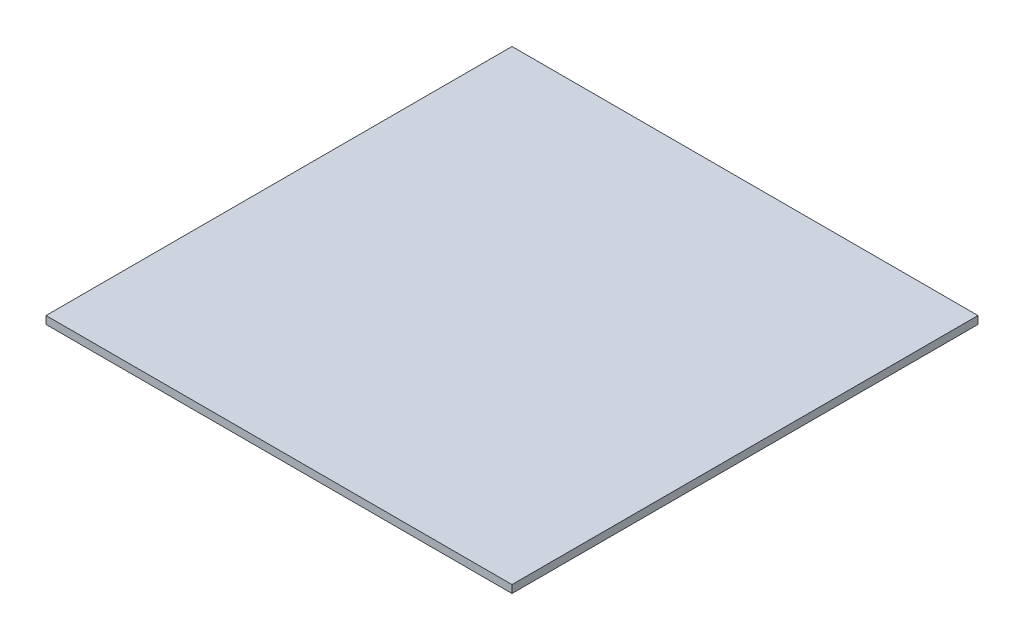
ISO-10303-21;
HEADER;
FILE_DESCRIPTION(('STEP AP214'),'2;1');
FILE_NAME('part.step','',(''),(''),'','','');
FILE_SCHEMA(('AUTOMOTIVE_DESIGN { 1 0 10303 214 1 1 1 1 }'));
ENDSEC;
DATA;
#1=APPLICATION_CONTEXT('core data for automotive mechanical design processes');
#2=APPLICATION_PROTOCOL_DEFINITION('international standard','automotive_design',2000,#1);
#3=PRODUCT_CONTEXT('',#1,'mechanical');
#4=PRODUCT('Part','Part','',(#3));
#5=PRODUCT_RELATED_PRODUCT_CATEGORY('part','',(#4));
#6=PRODUCT_DEFINITION_FORMATION('','',#4);
#7=PRODUCT_DEFINITION_CONTEXT('part definition',#1,'design');
#8=PRODUCT_DEFINITION('design','',#6,#7);
#9=PRODUCT_DEFINITION_SHAPE('','',#8);
#10=(LENGTH_UNIT() NAMED_UNIT(*) SI_UNIT(.MILLI.,.METRE.));
#11=(NAMED_UNIT(*) PLANE_ANGLE_UNIT() SI_UNIT($,.RADIAN.));
#12=(NAMED_UNIT(*) SI_UNIT($,.STERADIAN.) SOLID_ANGLE_UNIT());
#13=UNCERTAINTY_MEASURE_WITH_UNIT(LENGTH_MEASURE(1.E-05),#10,'distance_accuracy_value','');
#14=(GEOMETRIC_REPRESENTATION_CONTEXT(3) GLOBAL_UNCERTAINTY_ASSIGNED_CONTEXT((#13)) GLOBAL_UNIT_ASSIGNED_CONTEXT((#10,
#11,#12)) REPRESENTATION_CONTEXT('',''));
#15=CARTESIAN_POINT('',(0.,0.,0.));
#16=DIRECTION('',(0.,0.,1.));
#17=DIRECTION('',(1.,0.,0.));
#18=AXIS2_PLACEMENT_3D('',#15,#16,#17);
#19=CARTESIAN_POINT('',(150.,5.,-150.));
#20=DIRECTION('',(-1.,0.,0.));
#21=DIRECTION('',(0.,0.,1.));
#22=AXIS2_PLACEMENT_3D('',#19,#20,#21);
#23=PLANE('',#22);
#24=DIRECTION('',(0.,0.,-1.));
#25=VECTOR('',#24,1.);
#26=CARTESIAN_POINT('',(150.,0.,-150.));
#27=LINE('',#26,#25);
#28=CARTESIAN_POINT('',(150.,0.,150.));
#29=VERTEX_POINT('',#28);
#30=CARTESIAN_POINT('',(150.,0.,-150.));
#31=VERTEX_POINT('',#30);
#32=EDGE_CURVE('E99',#29,#31,#27,.T.);
#33=ORIENTED_EDGE('',*,*,#32,.T.);
#34=DIRECTION('',(0.,-1.,0.));
#35=VECTOR('',#34,1.);
#36=CARTESIAN_POINT('',(150.,5.,-150.));
#37=LINE('',#36,#35);
#38=CARTESIAN_POINT('',(150.,5.,-150.));
#39=VERTEX_POINT('',#38);
#40=EDGE_CURVE('E11',#39,#31,#37,.T.);
#41=ORIENTED_EDGE('',*,*,#40,.F.);
#42=DIRECTION('',(0.,0.,-1.));
#43=VECTOR('',#42,1.);
#44=CARTESIAN_POINT('',(150.,5.,-150.));
#45=LINE('',#44,#43);
#46=CARTESIAN_POINT('',(150.,5.,150.));
#47=VERTEX_POINT('',#46);
#48=EDGE_CURVE('E87',#47,#39,#45,.T.);
#49=ORIENTED_EDGE('',*,*,#48,.F.);
#50=DIRECTION('',(0.,-1.,0.));
#51=VECTOR('',#50,1.);
#52=CARTESIAN_POINT('',(150.,5.,150.));
#53=LINE('',#52,#51);
#54=EDGE_CURVE('E95',#47,#29,#53,.T.);
#55=ORIENTED_EDGE('',*,*,#54,.T.);
#56=EDGE_LOOP('',(#33,#41,#49,#55));
#57=FACE_BOUND('',#56,.T.);
#58=ADVANCED_FACE('F36',(#57),#23,.F.);
#59=CARTESIAN_POINT('',(-150.,5.,-150.));
#60=DIRECTION('',(0.,0.,1.));
#61=DIRECTION('',(1.,0.,0.));
#62=AXIS2_PLACEMENT_3D('',#59,#60,#61);
#63=PLANE('',#62);
#64=DIRECTION('',(-1.,0.,0.));
#65=VECTOR('',#64,1.);
#66=CARTESIAN_POINT('',(-150.,0.,-150.));
#67=LINE('',#66,#65);
#68=CARTESIAN_POINT('',(-150.,0.,-150.));
#69=VERTEX_POINT('',#68);
#70=EDGE_CURVE('E91',#31,#69,#67,.T.);
#71=ORIENTED_EDGE('',*,*,#70,.T.);
#72=DIRECTION('',(0.,-1.,0.));
#73=VECTOR('',#72,1.);
#74=CARTESIAN_POINT('',(-150.,5.,-150.));
#75=LINE('',#74,#73);
#76=CARTESIAN_POINT('',(-150.,5.,-150.));
#77=VERTEX_POINT('',#76);
#78=EDGE_CURVE('E44',#77,#69,#75,.T.);
#79=ORIENTED_EDGE('',*,*,#78,.F.);
#80=DIRECTION('',(-1.,0.,0.));
#81=VECTOR('',#80,1.);
#82=CARTESIAN_POINT('',(-150.,5.,-150.));
#83=LINE('',#82,#81);
#84=EDGE_CURVE('E82',#39,#77,#83,.T.);
#85=ORIENTED_EDGE('',*,*,#84,.F.);
#86=ORIENTED_EDGE('',*,*,#40,.T.);
#87=EDGE_LOOP('',(#71,#79,#85,#86));
#88=FACE_BOUND('',#87,.T.);
#89=ADVANCED_FACE('F90',(#88),#63,.F.);
#90=CARTESIAN_POINT('',(-150.,5.,-150.));
#91=DIRECTION('',(1.,0.,0.));
#92=DIRECTION('',(0.,0.,-1.));
#93=AXIS2_PLACEMENT_3D('',#90,#91,#92);
#94=PLANE('',#93);
#95=DIRECTION('',(0.,0.,1.));
#96=VECTOR('',#95,1.);
#97=CARTESIAN_POINT('',(-150.,0.,-150.));
#98=LINE('',#97,#96);
#99=CARTESIAN_POINT('',(-150.,0.,150.));
#100=VERTEX_POINT('',#99);
#101=EDGE_CURVE('E69',#69,#100,#98,.T.);
#102=ORIENTED_EDGE('',*,*,#101,.T.);
#103=DIRECTION('',(0.,-1.,0.));
#104=VECTOR('',#103,1.);
#105=CARTESIAN_POINT('',(-150.,5.,150.));
#106=LINE('',#105,#104);
#107=CARTESIAN_POINT('',(-150.,5.,150.));
#108=VERTEX_POINT('',#107);
#109=EDGE_CURVE('E92',#108,#100,#106,.T.);
#110=ORIENTED_EDGE('',*,*,#109,.F.);
#111=DIRECTION('',(0.,0.,1.));
#112=VECTOR('',#111,1.);
#113=CARTESIAN_POINT('',(-150.,5.,-150.));
#114=LINE('',#113,#112);
#115=EDGE_CURVE('E85',#77,#108,#114,.T.);
#116=ORIENTED_EDGE('',*,*,#115,.F.);
#117=ORIENTED_EDGE('',*,*,#78,.T.);
#118=EDGE_LOOP('',(#102,#110,#116,#117));
#119=FACE_BOUND('',#118,.T.);
#120=ADVANCED_FACE('F93',(#119),#94,.F.);
#121=CARTESIAN_POINT('',(-150.,5.,150.));
#122=DIRECTION('',(0.,0.,-1.));
#123=DIRECTION('',(-1.,0.,0.));
#124=AXIS2_PLACEMENT_3D('',#121,#122,#123);
#125=PLANE('',#124);
#126=DIRECTION('',(1.,0.,0.));
#127=VECTOR('',#126,1.);
#128=CARTESIAN_POINT('',(-150.,0.,150.));
#129=LINE('',#128,#127);
#130=EDGE_CURVE('E75',#100,#29,#129,.T.);
#131=ORIENTED_EDGE('',*,*,#130,.T.);
#132=ORIENTED_EDGE('',*,*,#54,.F.);
#133=DIRECTION('',(1.,0.,0.));
#134=VECTOR('',#133,1.);
#135=CARTESIAN_POINT('',(-150.,5.,150.));
#136=LINE('',#135,#134);
#137=EDGE_CURVE('E52',#108,#47,#136,.T.);
#138=ORIENTED_EDGE('',*,*,#137,.F.);
#139=ORIENTED_EDGE('',*,*,#109,.T.);
#140=EDGE_LOOP('',(#131,#132,#138,#139));
#141=FACE_BOUND('',#140,.T.);
#142=ADVANCED_FACE('F106',(#141),#125,.F.);
#143=CARTESIAN_POINT('',(0.,5.,0.));
#144=DIRECTION('',(0.,1.,0.));
#145=DIRECTION('',(0.,0.,1.));
#146=AXIS2_PLACEMENT_3D('',#143,#144,#145);
#147=PLANE('',#146);
#148=ORIENTED_EDGE('',*,*,#48,.T.);
#149=ORIENTED_EDGE('',*,*,#84,.T.);
#150=ORIENTED_EDGE('',*,*,#115,.T.);
#151=ORIENTED_EDGE('',*,*,#137,.T.);
#152=EDGE_LOOP('',(#148,#149,#150,#151));
#153=FACE_BOUND('',#152,.T.);
#154=ADVANCED_FACE('F83',(#153),#147,.T.);
#155=CARTESIAN_POINT('',(0.,0.,0.));
#156=DIRECTION('',(0.,1.,0.));
#157=DIRECTION('',(0.,0.,1.));
#158=AXIS2_PLACEMENT_3D('',#155,#156,#157);
#159=PLANE('',#158);
#160=ORIENTED_EDGE('',*,*,#32,.F.);
#161=ORIENTED_EDGE('',*,*,#130,.F.);
#162=ORIENTED_EDGE('',*,*,#101,.F.);
#163=ORIENTED_EDGE('',*,*,#70,.F.);
#164=EDGE_LOOP('',(#160,#161,#162,#163));
#165=FACE_BOUND('',#164,.T.);
#166=ADVANCED_FACE('F109',(#165),#159,.F.);
#167=CLOSED_SHELL('',(#58,#89,#120,#142,#154,#166));
#168=MANIFOLD_SOLID_BREP('B2',#167);
#169=ADVANCED_BREP_SHAPE_REPRESENTATION('',(#18,#168),#14);
#170=SHAPE_DEFINITION_REPRESENTATION(#9,#169);
ENDSEC;
END-ISO-10303-21;
